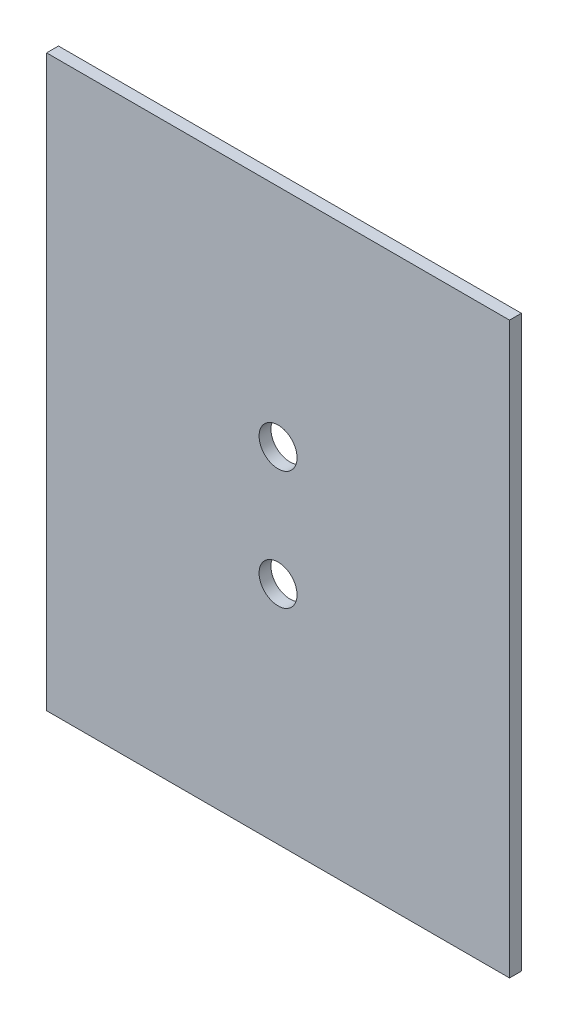
ISO-10303-21;
HEADER;
FILE_DESCRIPTION(('STEP AP214'),'2;1');
FILE_NAME('part.step','',(''),(''),'','','');
FILE_SCHEMA(('AUTOMOTIVE_DESIGN { 1 0 10303 214 1 1 1 1 }'));
ENDSEC;
DATA;
#1=APPLICATION_CONTEXT('core data for automotive mechanical design processes');
#2=APPLICATION_PROTOCOL_DEFINITION('international standard','automotive_design',2000,#1);
#3=PRODUCT_CONTEXT('',#1,'mechanical');
#4=PRODUCT('Part','Part','',(#3));
#5=PRODUCT_RELATED_PRODUCT_CATEGORY('part','',(#4));
#6=PRODUCT_DEFINITION_FORMATION('','',#4);
#7=PRODUCT_DEFINITION_CONTEXT('part definition',#1,'design');
#8=PRODUCT_DEFINITION('design','',#6,#7);
#9=PRODUCT_DEFINITION_SHAPE('','',#8);
#10=(LENGTH_UNIT() NAMED_UNIT(*) SI_UNIT(.MILLI.,.METRE.));
#11=(NAMED_UNIT(*) PLANE_ANGLE_UNIT() SI_UNIT($,.RADIAN.));
#12=(NAMED_UNIT(*) SI_UNIT($,.STERADIAN.) SOLID_ANGLE_UNIT());
#13=UNCERTAINTY_MEASURE_WITH_UNIT(LENGTH_MEASURE(1.E-05),#10,'distance_accuracy_value','');
#14=(GEOMETRIC_REPRESENTATION_CONTEXT(3) GLOBAL_UNCERTAINTY_ASSIGNED_CONTEXT((#13)) GLOBAL_UNIT_ASSIGNED_CONTEXT((#10,
#11,#12)) REPRESENTATION_CONTEXT('',''));
#15=CARTESIAN_POINT('',(0.,0.,0.));
#16=DIRECTION('',(0.,0.,1.));
#17=DIRECTION('',(1.,0.,0.));
#18=AXIS2_PLACEMENT_3D('',#15,#16,#17);
#19=CARTESIAN_POINT('',(0.,0.,5.));
#20=DIRECTION('',(0.,0.,1.));
#21=DIRECTION('',(1.,0.,0.));
#22=AXIS2_PLACEMENT_3D('',#19,#20,#21);
#23=PLANE('',#22);
#24=CARTESIAN_POINT('',(0.,25.0000000000001,5.));
#25=DIRECTION('',(0.,0.,1.));
#26=DIRECTION('',(1.,0.,0.));
#27=AXIS2_PLACEMENT_3D('',#24,#25,#26);
#28=CIRCLE('',#27,8.);
#29=CARTESIAN_POINT('',(8.,25.0000000000001,5.));
#30=VERTEX_POINT('',#29);
#31=EDGE_CURVE('E112',#30,#30,#28,.T.);
#32=ORIENTED_EDGE('',*,*,#31,.F.);
#33=EDGE_LOOP('',(#32));
#34=FACE_BOUND('',#33,.T.);
#35=DIRECTION('',(0.,1.,0.));
#36=VECTOR('',#35,1.);
#37=CARTESIAN_POINT('',(97.5,120.,5.));
#38=LINE('',#37,#36);
#39=CARTESIAN_POINT('',(97.5,-120.,5.));
#40=VERTEX_POINT('',#39);
#41=CARTESIAN_POINT('',(97.5,120.,5.));
#42=VERTEX_POINT('',#41);
#43=EDGE_CURVE('E92',#40,#42,#38,.T.);
#44=ORIENTED_EDGE('',*,*,#43,.T.);
#45=DIRECTION('',(-1.,0.,0.));
#46=VECTOR('',#45,1.);
#47=CARTESIAN_POINT('',(-97.5,120.,5.));
#48=LINE('',#47,#46);
#49=CARTESIAN_POINT('',(-97.5,120.,5.));
#50=VERTEX_POINT('',#49);
#51=EDGE_CURVE('E87',#42,#50,#48,.T.);
#52=ORIENTED_EDGE('',*,*,#51,.T.);
#53=DIRECTION('',(0.,-1.,0.));
#54=VECTOR('',#53,1.);
#55=CARTESIAN_POINT('',(-97.5,120.,5.));
#56=LINE('',#55,#54);
#57=CARTESIAN_POINT('',(-97.5,-120.,5.));
#58=VERTEX_POINT('',#57);
#59=EDGE_CURVE('E90',#50,#58,#56,.T.);
#60=ORIENTED_EDGE('',*,*,#59,.T.);
#61=DIRECTION('',(1.,0.,0.));
#62=VECTOR('',#61,1.);
#63=CARTESIAN_POINT('',(-97.5,-120.,5.));
#64=LINE('',#63,#62);
#65=EDGE_CURVE('E57',#58,#40,#64,.T.);
#66=ORIENTED_EDGE('',*,*,#65,.T.);
#67=EDGE_LOOP('',(#44,#52,#60,#66));
#68=FACE_BOUND('',#67,.T.);
#69=CARTESIAN_POINT('',(0.,-24.9999999999999,5.));
#70=DIRECTION('',(0.,0.,1.));
#71=DIRECTION('',(1.,0.,0.));
#72=AXIS2_PLACEMENT_3D('',#69,#70,#71);
#73=CIRCLE('',#72,8.);
#74=CARTESIAN_POINT('',(8.,-24.9999999999999,5.));
#75=VERTEX_POINT('',#74);
#76=EDGE_CURVE('E134',#75,#75,#73,.T.);
#77=ORIENTED_EDGE('',*,*,#76,.F.);
#78=EDGE_LOOP('',(#77));
#79=FACE_BOUND('',#78,.T.);
#80=ADVANCED_FACE('F39',(#34,#68,#79),#23,.T.);
#81=CARTESIAN_POINT('',(0.,0.,0.));
#82=DIRECTION('',(0.,0.,1.));
#83=DIRECTION('',(1.,0.,0.));
#84=AXIS2_PLACEMENT_3D('',#81,#82,#83);
#85=PLANE('',#84);
#86=DIRECTION('',(0.,1.,0.));
#87=VECTOR('',#86,1.);
#88=CARTESIAN_POINT('',(97.5,120.,0.));
#89=LINE('',#88,#87);
#90=CARTESIAN_POINT('',(97.5,-120.,0.));
#91=VERTEX_POINT('',#90);
#92=CARTESIAN_POINT('',(97.5,120.,0.));
#93=VERTEX_POINT('',#92);
#94=EDGE_CURVE('E108',#91,#93,#89,.T.);
#95=ORIENTED_EDGE('',*,*,#94,.F.);
#96=DIRECTION('',(1.,0.,0.));
#97=VECTOR('',#96,1.);
#98=CARTESIAN_POINT('',(-97.5,-120.,0.));
#99=LINE('',#98,#97);
#100=CARTESIAN_POINT('',(-97.5,-120.,0.));
#101=VERTEX_POINT('',#100);
#102=EDGE_CURVE('E80',#101,#91,#99,.T.);
#103=ORIENTED_EDGE('',*,*,#102,.F.);
#104=DIRECTION('',(0.,-1.,0.));
#105=VECTOR('',#104,1.);
#106=CARTESIAN_POINT('',(-97.5,120.,0.));
#107=LINE('',#106,#105);
#108=CARTESIAN_POINT('',(-97.5,120.,0.));
#109=VERTEX_POINT('',#108);
#110=EDGE_CURVE('E74',#109,#101,#107,.T.);
#111=ORIENTED_EDGE('',*,*,#110,.F.);
#112=DIRECTION('',(-1.,0.,0.));
#113=VECTOR('',#112,1.);
#114=CARTESIAN_POINT('',(-97.5,120.,0.));
#115=LINE('',#114,#113);
#116=EDGE_CURVE('E97',#93,#109,#115,.T.);
#117=ORIENTED_EDGE('',*,*,#116,.F.);
#118=EDGE_LOOP('',(#95,#103,#111,#117));
#119=FACE_BOUND('',#118,.T.);
#120=CARTESIAN_POINT('',(0.,25.0000000000001,0.));
#121=DIRECTION('',(0.,0.,1.));
#122=DIRECTION('',(1.,0.,0.));
#123=AXIS2_PLACEMENT_3D('',#120,#121,#122);
#124=CIRCLE('',#123,8.);
#125=CARTESIAN_POINT('',(8.,25.0000000000001,0.));
#126=VERTEX_POINT('',#125);
#127=EDGE_CURVE('E130',#126,#126,#124,.T.);
#128=ORIENTED_EDGE('',*,*,#127,.T.);
#129=EDGE_LOOP('',(#128));
#130=FACE_BOUND('',#129,.T.);
#131=CARTESIAN_POINT('',(0.,-24.9999999999999,0.));
#132=DIRECTION('',(0.,0.,1.));
#133=DIRECTION('',(1.,0.,0.));
#134=AXIS2_PLACEMENT_3D('',#131,#132,#133);
#135=CIRCLE('',#134,8.);
#136=CARTESIAN_POINT('',(8.,-24.9999999999999,0.));
#137=VERTEX_POINT('',#136);
#138=EDGE_CURVE('E138',#137,#137,#135,.T.);
#139=ORIENTED_EDGE('',*,*,#138,.T.);
#140=EDGE_LOOP('',(#139));
#141=FACE_BOUND('',#140,.T.);
#142=ADVANCED_FACE('F125',(#119,#130,#141),#85,.F.);
#143=CARTESIAN_POINT('',(97.5,120.,5.));
#144=DIRECTION('',(-1.,0.,0.));
#145=DIRECTION('',(0.,-1.,0.));
#146=AXIS2_PLACEMENT_3D('',#143,#144,#145);
#147=PLANE('',#146);
#148=ORIENTED_EDGE('',*,*,#94,.T.);
#149=DIRECTION('',(0.,0.,-1.));
#150=VECTOR('',#149,1.);
#151=CARTESIAN_POINT('',(97.5,120.,5.));
#152=LINE('',#151,#150);
#153=EDGE_CURVE('E11',#42,#93,#152,.T.);
#154=ORIENTED_EDGE('',*,*,#153,.F.);
#155=ORIENTED_EDGE('',*,*,#43,.F.);
#156=DIRECTION('',(0.,0.,-1.));
#157=VECTOR('',#156,1.);
#158=CARTESIAN_POINT('',(97.5,-120.,5.));
#159=LINE('',#158,#157);
#160=EDGE_CURVE('E104',#40,#91,#159,.T.);
#161=ORIENTED_EDGE('',*,*,#160,.T.);
#162=EDGE_LOOP('',(#148,#154,#155,#161));
#163=FACE_BOUND('',#162,.T.);
#164=ADVANCED_FACE('F41',(#163),#147,.F.);
#165=CARTESIAN_POINT('',(-97.5,120.,5.));
#166=DIRECTION('',(0.,-1.,0.));
#167=DIRECTION('',(0.,0.,-1.));
#168=AXIS2_PLACEMENT_3D('',#165,#166,#167);
#169=PLANE('',#168);
#170=ORIENTED_EDGE('',*,*,#116,.T.);
#171=DIRECTION('',(0.,0.,-1.));
#172=VECTOR('',#171,1.);
#173=CARTESIAN_POINT('',(-97.5,120.,5.));
#174=LINE('',#173,#172);
#175=EDGE_CURVE('E49',#50,#109,#174,.T.);
#176=ORIENTED_EDGE('',*,*,#175,.F.);
#177=ORIENTED_EDGE('',*,*,#51,.F.);
#178=ORIENTED_EDGE('',*,*,#153,.T.);
#179=EDGE_LOOP('',(#170,#176,#177,#178));
#180=FACE_BOUND('',#179,.T.);
#181=ADVANCED_FACE('F96',(#180),#169,.F.);
#182=CARTESIAN_POINT('',(-97.5,120.,5.));
#183=DIRECTION('',(1.,0.,0.));
#184=DIRECTION('',(0.,1.,0.));
#185=AXIS2_PLACEMENT_3D('',#182,#183,#184);
#186=PLANE('',#185);
#187=ORIENTED_EDGE('',*,*,#110,.T.);
#188=DIRECTION('',(0.,0.,-1.));
#189=VECTOR('',#188,1.);
#190=CARTESIAN_POINT('',(-97.5,-120.,5.));
#191=LINE('',#190,#189);
#192=EDGE_CURVE('E99',#58,#101,#191,.T.);
#193=ORIENTED_EDGE('',*,*,#192,.F.);
#194=ORIENTED_EDGE('',*,*,#59,.F.);
#195=ORIENTED_EDGE('',*,*,#175,.T.);
#196=EDGE_LOOP('',(#187,#193,#194,#195));
#197=FACE_BOUND('',#196,.T.);
#198=ADVANCED_FACE('F100',(#197),#186,.F.);
#199=CARTESIAN_POINT('',(-97.5,-120.,5.));
#200=DIRECTION('',(0.,1.,0.));
#201=DIRECTION('',(0.,0.,1.));
#202=AXIS2_PLACEMENT_3D('',#199,#200,#201);
#203=PLANE('',#202);
#204=ORIENTED_EDGE('',*,*,#102,.T.);
#205=ORIENTED_EDGE('',*,*,#160,.F.);
#206=ORIENTED_EDGE('',*,*,#65,.F.);
#207=ORIENTED_EDGE('',*,*,#192,.T.);
#208=EDGE_LOOP('',(#204,#205,#206,#207));
#209=FACE_BOUND('',#208,.T.);
#210=ADVANCED_FACE('F122',(#209),#203,.F.);
#211=CARTESIAN_POINT('',(0.,25.0000000000001,5.));
#212=DIRECTION('',(0.,0.,-1.));
#213=DIRECTION('',(-1.,0.,0.));
#214=AXIS2_PLACEMENT_3D('',#211,#212,#213);
#215=CYLINDRICAL_SURFACE('',#214,8.);
#216=ORIENTED_EDGE('',*,*,#31,.T.);
#217=EDGE_LOOP('',(#216));
#218=FACE_BOUND('',#217,.T.);
#219=ORIENTED_EDGE('',*,*,#127,.F.);
#220=EDGE_LOOP('',(#219));
#221=FACE_BOUND('',#220,.T.);
#222=ADVANCED_FACE('F157',(#218,#221),#215,.F.);
#223=CARTESIAN_POINT('',(0.,-24.9999999999999,5.));
#224=DIRECTION('',(0.,0.,-1.));
#225=DIRECTION('',(-1.,0.,0.));
#226=AXIS2_PLACEMENT_3D('',#223,#224,#225);
#227=CYLINDRICAL_SURFACE('',#226,8.);
#228=ORIENTED_EDGE('',*,*,#76,.T.);
#229=EDGE_LOOP('',(#228));
#230=FACE_BOUND('',#229,.T.);
#231=ORIENTED_EDGE('',*,*,#138,.F.);
#232=EDGE_LOOP('',(#231));
#233=FACE_BOUND('',#232,.T.);
#234=ADVANCED_FACE('F146',(#230,#233),#227,.F.);
#235=CLOSED_SHELL('',(#80,#142,#164,#181,#198,#210,#222,#234));
#236=MANIFOLD_SOLID_BREP('B2',#235);
#237=ADVANCED_BREP_SHAPE_REPRESENTATION('',(#18,#236),#14);
#238=SHAPE_DEFINITION_REPRESENTATION(#9,#237);
ENDSEC;
END-ISO-10303-21;
